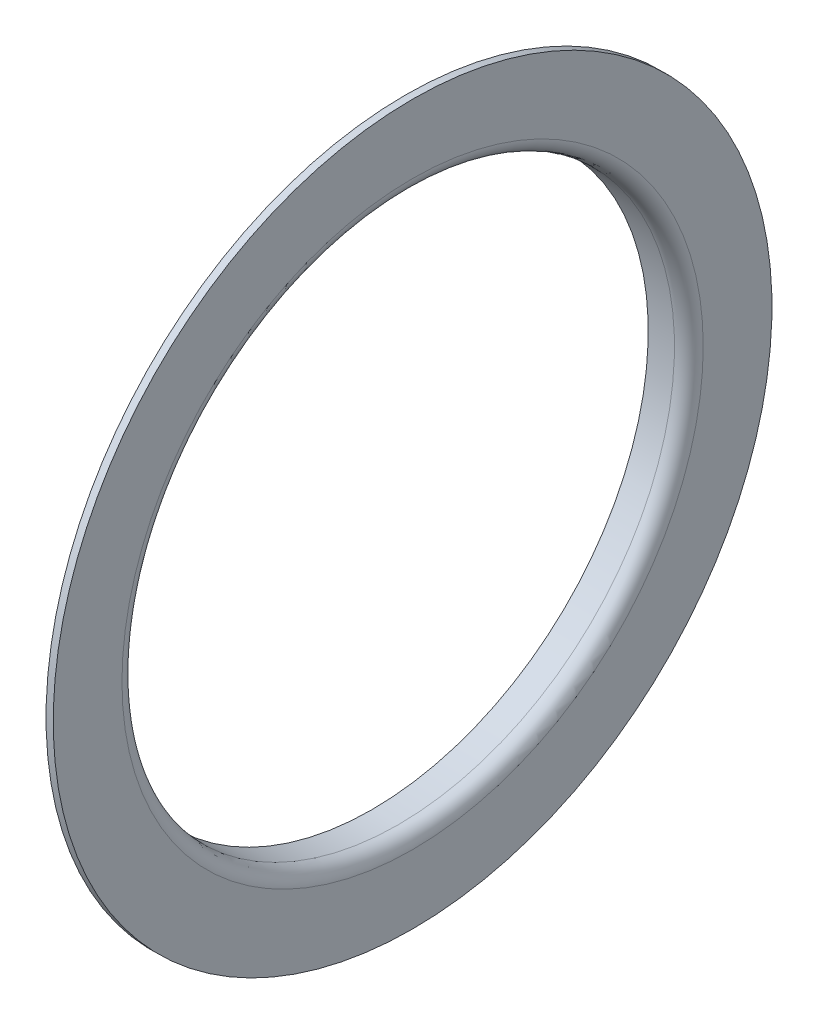
ISO-10303-21;
HEADER;
FILE_DESCRIPTION(('STEP AP214'),'2;1');
FILE_NAME('part.step','',(''),(''),'','','');
FILE_SCHEMA(('AUTOMOTIVE_DESIGN { 1 0 10303 214 1 1 1 1 }'));
ENDSEC;
DATA;
#1=APPLICATION_CONTEXT('core data for automotive mechanical design processes');
#2=APPLICATION_PROTOCOL_DEFINITION('international standard','automotive_design',2000,#1);
#3=PRODUCT_CONTEXT('',#1,'mechanical');
#4=PRODUCT('Part','Part','',(#3));
#5=PRODUCT_RELATED_PRODUCT_CATEGORY('part','',(#4));
#6=PRODUCT_DEFINITION_FORMATION('','',#4);
#7=PRODUCT_DEFINITION_CONTEXT('part definition',#1,'design');
#8=PRODUCT_DEFINITION('design','',#6,#7);
#9=PRODUCT_DEFINITION_SHAPE('','',#8);
#10=(LENGTH_UNIT() NAMED_UNIT(*) SI_UNIT(.MILLI.,.METRE.));
#11=(NAMED_UNIT(*) PLANE_ANGLE_UNIT() SI_UNIT($,.RADIAN.));
#12=(NAMED_UNIT(*) SI_UNIT($,.STERADIAN.) SOLID_ANGLE_UNIT());
#13=UNCERTAINTY_MEASURE_WITH_UNIT(LENGTH_MEASURE(1.E-05),#10,'distance_accuracy_value','');
#14=(GEOMETRIC_REPRESENTATION_CONTEXT(3) GLOBAL_UNCERTAINTY_ASSIGNED_CONTEXT((#13)) GLOBAL_UNIT_ASSIGNED_CONTEXT((#10,
#11,#12)) REPRESENTATION_CONTEXT('',''));
#15=CARTESIAN_POINT('',(0.,0.,0.));
#16=DIRECTION('',(0.,0.,1.));
#17=DIRECTION('',(1.,0.,0.));
#18=AXIS2_PLACEMENT_3D('',#15,#16,#17);
#19=CARTESIAN_POINT('',(-13.117418,0.,0.));
#20=DIRECTION('',(-1.,0.,0.));
#21=DIRECTION('',(0.,-1.,0.));
#22=AXIS2_PLACEMENT_3D('',#19,#20,#21);
#23=CYLINDRICAL_SURFACE('',#22,31.42);
#24=CARTESIAN_POINT('',(-13.117418,0.,0.));
#25=DIRECTION('',(-1.,0.,0.));
#26=DIRECTION('',(0.,-1.,0.));
#27=AXIS2_PLACEMENT_3D('',#24,#25,#26);
#28=CIRCLE('',#27,31.42);
#29=CARTESIAN_POINT('',(-13.117418,-31.42,0.));
#30=VERTEX_POINT('',#29);
#31=EDGE_CURVE('E29',#30,#30,#28,.T.);
#32=ORIENTED_EDGE('',*,*,#31,.F.);
#33=EDGE_LOOP('',(#32));
#34=FACE_BOUND('',#33,.T.);
#35=CARTESIAN_POINT('',(-16.1,0.,0.));
#36=DIRECTION('',(-1.,0.,0.));
#37=DIRECTION('',(0.,-1.,0.));
#38=AXIS2_PLACEMENT_3D('',#35,#36,#37);
#39=CIRCLE('',#38,31.42);
#40=CARTESIAN_POINT('',(-16.1,-31.42,0.));
#41=VERTEX_POINT('',#40);
#42=EDGE_CURVE('E17',#41,#41,#39,.F.);
#43=ORIENTED_EDGE('',*,*,#42,.F.);
#44=EDGE_LOOP('',(#43));
#45=FACE_BOUND('',#44,.T.);
#46=ADVANCED_FACE('F14',(#34,#45),#23,.F.);
#47=CARTESIAN_POINT('',(-16.1,0.,31.828709));
#48=DIRECTION('',(-1.,0.,0.));
#49=DIRECTION('',(0.,-1.,0.));
#50=AXIS2_PLACEMENT_3D('',#47,#48,#49);
#51=PLANE('',#50);
#52=CARTESIAN_POINT('',(-16.1,0.,0.));
#53=DIRECTION('',(-1.,0.,0.));
#54=DIRECTION('',(0.,-1.,0.));
#55=AXIS2_PLACEMENT_3D('',#52,#53,#54);
#56=CIRCLE('',#55,32.237418);
#57=CARTESIAN_POINT('',(-16.1,-32.237418,0.));
#58=VERTEX_POINT('',#57);
#59=EDGE_CURVE('E33',#58,#58,#56,.F.);
#60=ORIENTED_EDGE('',*,*,#59,.F.);
#61=EDGE_LOOP('',(#60));
#62=FACE_BOUND('',#61,.T.);
#63=ORIENTED_EDGE('',*,*,#42,.T.);
#64=EDGE_LOOP('',(#63));
#65=FACE_BOUND('',#64,.T.);
#66=ADVANCED_FACE('F45',(#62,#65),#51,.T.);
#67=CARTESIAN_POINT('',(-13.117418,0.,0.));
#68=DIRECTION('',(-1.,0.,0.));
#69=DIRECTION('',(0.,-1.,0.));
#70=AXIS2_PLACEMENT_3D('',#67,#68,#69);
#71=TOROIDAL_SURFACE('',#70,33.054836,1.634836);
#72=ORIENTED_EDGE('',*,*,#31,.T.);
#73=EDGE_LOOP('',(#72));
#74=FACE_BOUND('',#73,.T.);
#75=CARTESIAN_POINT('',(-11.482582,0.,0.));
#76=DIRECTION('',(1.,0.,0.));
#77=DIRECTION('',(0.,0.,1.));
#78=AXIS2_PLACEMENT_3D('',#75,#76,#77);
#79=CIRCLE('',#78,33.054836);
#80=CARTESIAN_POINT('',(-11.482582,0.,33.054836));
#81=VERTEX_POINT('',#80);
#82=EDGE_CURVE('E35',#81,#81,#79,.F.);
#83=ORIENTED_EDGE('',*,*,#82,.F.);
#84=EDGE_LOOP('',(#83));
#85=FACE_BOUND('',#84,.T.);
#86=ADVANCED_FACE('F53',(#74,#85),#71,.T.);
#87=CARTESIAN_POINT('',(-14.608709,0.,0.));
#88=DIRECTION('',(-1.,0.,0.));
#89=DIRECTION('',(0.,-1.,0.));
#90=AXIS2_PLACEMENT_3D('',#87,#88,#89);
#91=CYLINDRICAL_SURFACE('',#90,32.237418);
#92=ORIENTED_EDGE('',*,*,#59,.T.);
#93=EDGE_LOOP('',(#92));
#94=FACE_BOUND('',#93,.T.);
#95=CARTESIAN_POINT('',(-13.117418,0.,0.));
#96=DIRECTION('',(-1.,0.,0.));
#97=DIRECTION('',(0.,-1.,0.));
#98=AXIS2_PLACEMENT_3D('',#95,#96,#97);
#99=CIRCLE('',#98,32.237418);
#100=CARTESIAN_POINT('',(-13.117418,-32.237418,0.));
#101=VERTEX_POINT('',#100);
#102=EDGE_CURVE('E32',#101,#101,#99,.F.);
#103=ORIENTED_EDGE('',*,*,#102,.F.);
#104=EDGE_LOOP('',(#103));
#105=FACE_BOUND('',#104,.T.);
#106=ADVANCED_FACE('F114',(#94,#105),#91,.T.);
#107=CARTESIAN_POINT('',(-11.482582,0.,36.962868));
#108=DIRECTION('',(1.,0.,0.));
#109=DIRECTION('',(0.,1.,0.));
#110=AXIS2_PLACEMENT_3D('',#107,#108,#109);
#111=PLANE('',#110);
#112=ORIENTED_EDGE('',*,*,#82,.T.);
#113=EDGE_LOOP('',(#112));
#114=FACE_BOUND('',#113,.T.);
#115=CARTESIAN_POINT('',(-11.482582,0.,0.));
#116=DIRECTION('',(-1.,0.,0.));
#117=DIRECTION('',(0.,-1.,0.));
#118=AXIS2_PLACEMENT_3D('',#115,#116,#117);
#119=CIRCLE('',#118,40.8709);
#120=CARTESIAN_POINT('',(-11.482582,-40.8709,0.));
#121=VERTEX_POINT('',#120);
#122=EDGE_CURVE('E26',#121,#121,#119,.T.);
#123=ORIENTED_EDGE('',*,*,#122,.F.);
#124=EDGE_LOOP('',(#123));
#125=FACE_BOUND('',#124,.T.);
#126=ADVANCED_FACE('F85',(#114,#125),#111,.T.);
#127=CARTESIAN_POINT('',(-13.117418,0.,0.));
#128=DIRECTION('',(-1.,0.,0.));
#129=DIRECTION('',(0.,-1.,0.));
#130=AXIS2_PLACEMENT_3D('',#127,#128,#129);
#131=TOROIDAL_SURFACE('',#130,33.054836,0.817418000000004);
#132=CARTESIAN_POINT('',(-12.3,0.,0.));
#133=DIRECTION('',(-1.,0.,0.));
#134=DIRECTION('',(0.,0.,1.));
#135=AXIS2_PLACEMENT_3D('',#132,#133,#134);
#136=CIRCLE('',#135,33.054836);
#137=CARTESIAN_POINT('',(-12.3,0.,33.054836));
#138=VERTEX_POINT('',#137);
#139=EDGE_CURVE('E21',#138,#138,#136,.F.);
#140=ORIENTED_EDGE('',*,*,#139,.F.);
#141=EDGE_LOOP('',(#140));
#142=FACE_BOUND('',#141,.T.);
#143=ORIENTED_EDGE('',*,*,#102,.T.);
#144=EDGE_LOOP('',(#143));
#145=FACE_BOUND('',#144,.T.);
#146=ADVANCED_FACE('F62',(#142,#145),#131,.F.);
#147=CARTESIAN_POINT('',(-11.891291,0.,0.));
#148=DIRECTION('',(-1.,0.,0.));
#149=DIRECTION('',(0.,-1.,0.));
#150=AXIS2_PLACEMENT_3D('',#147,#148,#149);
#151=CYLINDRICAL_SURFACE('',#150,40.8709);
#152=CARTESIAN_POINT('',(-12.3,0.,0.));
#153=DIRECTION('',(-1.,0.,0.));
#154=DIRECTION('',(0.,-1.,0.));
#155=AXIS2_PLACEMENT_3D('',#152,#153,#154);
#156=CIRCLE('',#155,40.8709);
#157=CARTESIAN_POINT('',(-12.3,-40.8709,0.));
#158=VERTEX_POINT('',#157);
#159=EDGE_CURVE('E10',#158,#158,#156,.T.);
#160=ORIENTED_EDGE('',*,*,#159,.F.);
#161=EDGE_LOOP('',(#160));
#162=FACE_BOUND('',#161,.T.);
#163=ORIENTED_EDGE('',*,*,#122,.T.);
#164=EDGE_LOOP('',(#163));
#165=FACE_BOUND('',#164,.T.);
#166=ADVANCED_FACE('F57',(#162,#165),#151,.T.);
#167=CARTESIAN_POINT('',(-12.3,0.,36.962868));
#168=DIRECTION('',(-1.,0.,0.));
#169=DIRECTION('',(0.,-1.,0.));
#170=AXIS2_PLACEMENT_3D('',#167,#168,#169);
#171=PLANE('',#170);
#172=ORIENTED_EDGE('',*,*,#159,.T.);
#173=EDGE_LOOP('',(#172));
#174=FACE_BOUND('',#173,.T.);
#175=ORIENTED_EDGE('',*,*,#139,.T.);
#176=EDGE_LOOP('',(#175));
#177=FACE_BOUND('',#176,.T.);
#178=ADVANCED_FACE('F55',(#174,#177),#171,.T.);
#179=CLOSED_SHELL('',(#46,#66,#86,#106,#126,#146,#166,#178));
#180=MANIFOLD_SOLID_BREP('B1',#179);
#181=ADVANCED_BREP_SHAPE_REPRESENTATION('',(#18,#180),#14);
#182=SHAPE_DEFINITION_REPRESENTATION(#9,#181);
ENDSEC;
END-ISO-10303-21;
